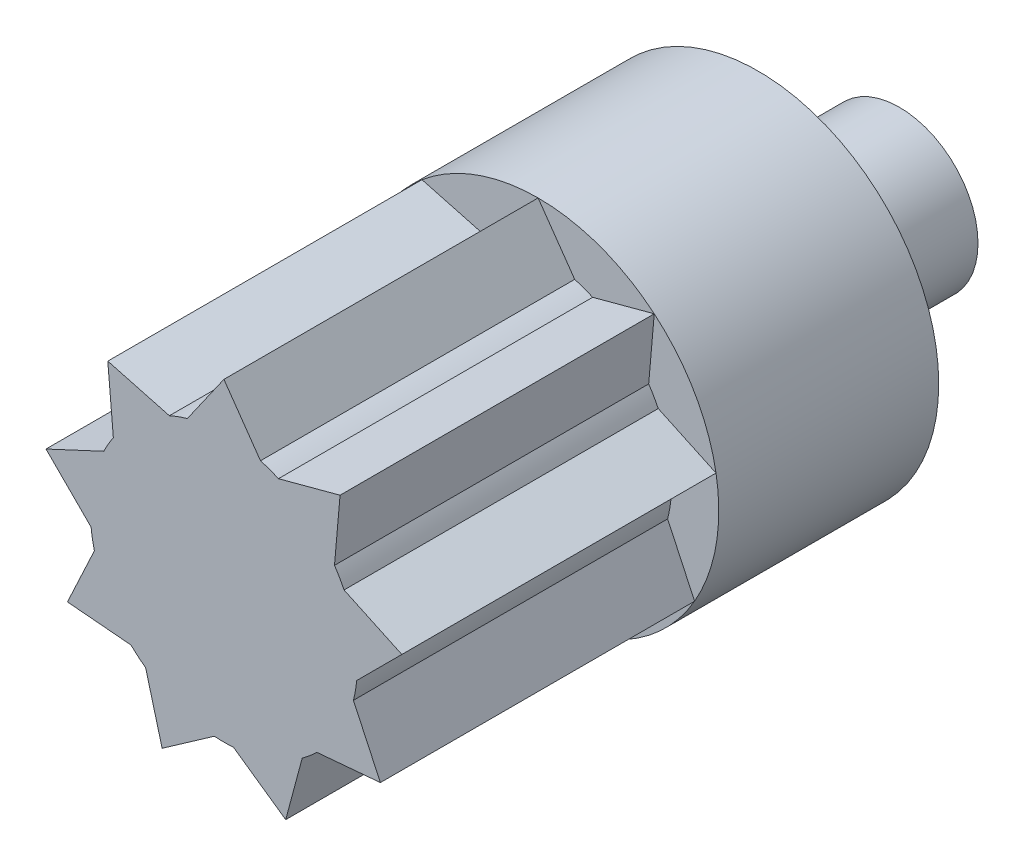
ISO-10303-21;
HEADER;
FILE_DESCRIPTION(('STEP AP214'),'2;1');
FILE_NAME('part.step','',(''),(''),'','','');
FILE_SCHEMA(('AUTOMOTIVE_DESIGN { 1 0 10303 214 1 1 1 1 }'));
ENDSEC;
DATA;
#1=APPLICATION_CONTEXT('core data for automotive mechanical design processes');
#2=APPLICATION_PROTOCOL_DEFINITION('international standard','automotive_design',2000,#1);
#3=PRODUCT_CONTEXT('',#1,'mechanical');
#4=PRODUCT('Part','Part','',(#3));
#5=PRODUCT_RELATED_PRODUCT_CATEGORY('part','',(#4));
#6=PRODUCT_DEFINITION_FORMATION('','',#4);
#7=PRODUCT_DEFINITION_CONTEXT('part definition',#1,'design');
#8=PRODUCT_DEFINITION('design','',#6,#7);
#9=PRODUCT_DEFINITION_SHAPE('','',#8);
#10=(LENGTH_UNIT() NAMED_UNIT(*) SI_UNIT(.MILLI.,.METRE.));
#11=(NAMED_UNIT(*) PLANE_ANGLE_UNIT() SI_UNIT($,.RADIAN.));
#12=(NAMED_UNIT(*) SI_UNIT($,.STERADIAN.) SOLID_ANGLE_UNIT());
#13=UNCERTAINTY_MEASURE_WITH_UNIT(LENGTH_MEASURE(1.E-05),#10,'distance_accuracy_value','');
#14=(GEOMETRIC_REPRESENTATION_CONTEXT(3) GLOBAL_UNCERTAINTY_ASSIGNED_CONTEXT((#13)) GLOBAL_UNIT_ASSIGNED_CONTEXT((#10,
#11,#12)) REPRESENTATION_CONTEXT('',''));
#15=CARTESIAN_POINT('',(0.,0.,0.));
#16=DIRECTION('',(0.,0.,1.));
#17=DIRECTION('',(1.,0.,0.));
#18=AXIS2_PLACEMENT_3D('',#15,#16,#17);
#19=CARTESIAN_POINT('',(-28.51,2.5,-4.));
#20=DIRECTION('',(0.,0.,1.));
#21=DIRECTION('',(1.,0.,0.));
#22=AXIS2_PLACEMENT_3D('',#19,#20,#21);
#23=PLANE('',#22);
#24=CARTESIAN_POINT('',(0.,0.,-4.));
#25=DIRECTION('',(0.,0.,1.));
#26=DIRECTION('',(1.,0.,0.));
#27=AXIS2_PLACEMENT_3D('',#24,#25,#26);
#28=CIRCLE('',#27,2.5);
#29=CARTESIAN_POINT('',(2.5,0.,-4.));
#30=VERTEX_POINT('',#29);
#31=EDGE_CURVE('E488',#30,#30,#28,.T.);
#32=ORIENTED_EDGE('',*,*,#31,.F.);
#33=EDGE_LOOP('',(#32));
#34=FACE_BOUND('',#33,.T.);
#35=ADVANCED_FACE('F41',(#34),#23,.F.);
#36=CARTESIAN_POINT('',(0.,0.,17.5));
#37=DIRECTION('',(0.,0.,-1.));
#38=DIRECTION('',(-1.,0.,0.));
#39=AXIS2_PLACEMENT_3D('',#36,#37,#38);
#40=CYLINDRICAL_SURFACE('',#39,5.75);
#41=CARTESIAN_POINT('',(0.,0.,0.5));
#42=DIRECTION('',(0.,0.,1.));
#43=DIRECTION('',(1.,0.,0.));
#44=AXIS2_PLACEMENT_3D('',#41,#42,#43);
#45=CIRCLE('',#44,5.75);
#46=CARTESIAN_POINT('',(5.75,0.,0.5));
#47=VERTEX_POINT('',#46);
#48=EDGE_CURVE('E486',#47,#47,#45,.T.);
#49=ORIENTED_EDGE('',*,*,#48,.T.);
#50=EDGE_LOOP('',(#49));
#51=FACE_BOUND('',#50,.T.);
#52=CARTESIAN_POINT('',(0.,0.,7.5));
#53=DIRECTION('',(0.,0.,1.));
#54=DIRECTION('',(1.,0.,0.));
#55=AXIS2_PLACEMENT_3D('',#52,#53,#54);
#56=CIRCLE('',#55,5.75);
#57=CARTESIAN_POINT('',(3.6960287556976,4.40475554793412,7.5));
#58=VERTEX_POINT('',#57);
#59=CARTESIAN_POINT('',(0.,5.75,7.5));
#60=VERTEX_POINT('',#59);
#61=EDGE_CURVE('E370',#58,#60,#56,.T.);
#62=ORIENTED_EDGE('',*,*,#61,.F.);
#63=CARTESIAN_POINT('',(0.,0.,7.5));
#64=DIRECTION('',(0.,0.,1.));
#65=DIRECTION('',(1.,0.,0.));
#66=AXIS2_PLACEMENT_3D('',#63,#64,#65);
#67=CIRCLE('',#66,5.75);
#68=CARTESIAN_POINT('',(5.6626445798202,0.99847702158485,7.5));
#69=VERTEX_POINT('',#68);
#70=EDGE_CURVE('E356',#69,#58,#67,.T.);
#71=ORIENTED_EDGE('',*,*,#70,.F.);
#72=CARTESIAN_POINT('',(0.,0.,7.5));
#73=DIRECTION('',(0.,0.,1.));
#74=DIRECTION('',(1.,0.,0.));
#75=AXIS2_PLACEMENT_3D('',#72,#73,#74);
#76=CIRCLE('',#75,5.75);
#77=CARTESIAN_POINT('',(4.97964607176052,-2.875,7.5));
#78=VERTEX_POINT('',#77);
#79=EDGE_CURVE('E426',#78,#69,#76,.T.);
#80=ORIENTED_EDGE('',*,*,#79,.F.);
#81=CARTESIAN_POINT('',(0.,0.,7.5));
#82=DIRECTION('',(0.,0.,1.));
#83=DIRECTION('',(1.,0.,0.));
#84=AXIS2_PLACEMENT_3D('',#81,#82,#83);
#85=CIRCLE('',#84,5.75);
#86=CARTESIAN_POINT('',(1.9666158241226,-5.40323256951897,7.5));
#87=VERTEX_POINT('',#86);
#88=EDGE_CURVE('E334',#87,#78,#85,.T.);
#89=ORIENTED_EDGE('',*,*,#88,.F.);
#90=CARTESIAN_POINT('',(0.,0.,7.5));
#91=DIRECTION('',(0.,0.,1.));
#92=DIRECTION('',(1.,0.,0.));
#93=AXIS2_PLACEMENT_3D('',#90,#91,#92);
#94=CIRCLE('',#93,5.75);
#95=CARTESIAN_POINT('',(-1.9666158241226,-5.40323256951897,7.5));
#96=VERTEX_POINT('',#95);
#97=EDGE_CURVE('E452',#96,#87,#94,.T.);
#98=ORIENTED_EDGE('',*,*,#97,.F.);
#99=CARTESIAN_POINT('',(0.,0.,7.5));
#100=DIRECTION('',(0.,0.,1.));
#101=DIRECTION('',(1.,0.,0.));
#102=AXIS2_PLACEMENT_3D('',#99,#100,#101);
#103=CIRCLE('',#102,5.75);
#104=CARTESIAN_POINT('',(-4.97964607176052,-2.875,7.5));
#105=VERTEX_POINT('',#104);
#106=EDGE_CURVE('E310',#105,#96,#103,.T.);
#107=ORIENTED_EDGE('',*,*,#106,.F.);
#108=CARTESIAN_POINT('',(0.,0.,7.5));
#109=DIRECTION('',(0.,0.,1.));
#110=DIRECTION('',(1.,0.,0.));
#111=AXIS2_PLACEMENT_3D('',#108,#109,#110);
#112=CIRCLE('',#111,5.75);
#113=CARTESIAN_POINT('',(-5.6626445798202,0.998477021584847,7.5));
#114=VERTEX_POINT('',#113);
#115=EDGE_CURVE('E477',#114,#105,#112,.T.);
#116=ORIENTED_EDGE('',*,*,#115,.F.);
#117=CARTESIAN_POINT('',(0.,0.,7.5));
#118=DIRECTION('',(0.,0.,1.));
#119=DIRECTION('',(1.,0.,0.));
#120=AXIS2_PLACEMENT_3D('',#117,#118,#119);
#121=CIRCLE('',#120,5.75);
#122=CARTESIAN_POINT('',(-3.6960287556976,4.40475554793412,7.5));
#123=VERTEX_POINT('',#122);
#124=EDGE_CURVE('E286',#123,#114,#121,.T.);
#125=ORIENTED_EDGE('',*,*,#124,.F.);
#126=CARTESIAN_POINT('',(0.,0.,7.5));
#127=DIRECTION('',(0.,0.,1.));
#128=DIRECTION('',(1.,0.,0.));
#129=AXIS2_PLACEMENT_3D('',#126,#127,#128);
#130=CIRCLE('',#129,5.75);
#131=EDGE_CURVE('E260',#60,#123,#130,.T.);
#132=ORIENTED_EDGE('',*,*,#131,.F.);
#133=EDGE_LOOP('',(#62,#71,#80,#89,#98,#107,#116,#125,#132));
#134=FACE_BOUND('',#133,.T.);
#135=ADVANCED_FACE('F381',(#51,#134),#40,.T.);
#136=CARTESIAN_POINT('',(0.,0.,0.5));
#137=DIRECTION('',(0.,0.,-1.));
#138=DIRECTION('',(-1.,0.,0.));
#139=AXIS2_PLACEMENT_3D('',#136,#137,#138);
#140=CYLINDRICAL_SURFACE('',#139,2.5);
#141=CARTESIAN_POINT('',(0.,0.,0.5));
#142=DIRECTION('',(0.,0.,1.));
#143=DIRECTION('',(1.,0.,0.));
#144=AXIS2_PLACEMENT_3D('',#141,#142,#143);
#145=CIRCLE('',#144,2.5);
#146=CARTESIAN_POINT('',(2.5,0.,0.5));
#147=VERTEX_POINT('',#146);
#148=EDGE_CURVE('E492',#147,#147,#145,.T.);
#149=ORIENTED_EDGE('',*,*,#148,.F.);
#150=EDGE_LOOP('',(#149));
#151=FACE_BOUND('',#150,.T.);
#152=ORIENTED_EDGE('',*,*,#31,.T.);
#153=EDGE_LOOP('',(#152));
#154=FACE_BOUND('',#153,.T.);
#155=ADVANCED_FACE('F501',(#151,#154),#140,.T.);
#156=CARTESIAN_POINT('',(0.,0.,17.5));
#157=DIRECTION('',(0.,0.,1.));
#158=DIRECTION('',(1.,0.,0.));
#159=AXIS2_PLACEMENT_3D('',#156,#157,#158);
#160=PLANE('',#159);
#161=DIRECTION('',(0.573576436351047,-0.819152044288991,0.));
#162=VECTOR('',#161,1.);
#163=CARTESIAN_POINT('',(2.70161628475949,1.89169208793871,17.5));
#164=LINE('',#163,#162);
#165=CARTESIAN_POINT('',(0.,5.75,17.5));
#166=VERTEX_POINT('',#165);
#167=CARTESIAN_POINT('',(1.16412429290387,4.08745821148927,17.5));
#168=VERTEX_POINT('',#167);
#169=EDGE_CURVE('E251',#166,#168,#164,.T.);
#170=ORIENTED_EDGE('',*,*,#169,.F.);
#171=DIRECTION('',(-0.573576436351047,-0.819152044288991,0.));
#172=VECTOR('',#171,1.);
#173=CARTESIAN_POINT('',(-2.70161628475949,1.89169208793871,17.5));
#174=LINE('',#173,#172);
#175=CARTESIAN_POINT('',(-1.16412429290387,4.08745821148927,17.5));
#176=VERTEX_POINT('',#175);
#177=EDGE_CURVE('E238',#166,#176,#174,.T.);
#178=ORIENTED_EDGE('',*,*,#177,.T.);
#179=CARTESIAN_POINT('',(0.,0.,17.5));
#180=DIRECTION('',(0.,0.,1.));
#181=DIRECTION('',(1.,0.,0.));
#182=AXIS2_PLACEMENT_3D('',#179,#180,#181);
#183=CIRCLE('',#182,4.25);
#184=CARTESIAN_POINT('',(-1.73559654777799,3.8794593210061,17.5));
#185=VERTEX_POINT('',#184);
#186=EDGE_CURVE('E226',#176,#185,#183,.T.);
#187=ORIENTED_EDGE('',*,*,#186,.T.);
#188=DIRECTION('',(0.965925826289069,-0.258819045102519,0.));
#189=VECTOR('',#188,1.);
#190=CARTESIAN_POINT('',(0.853601906910682,3.18568568602837,17.5));
#191=LINE('',#190,#189);
#192=CARTESIAN_POINT('',(-3.6960287556976,4.40475554793412,17.5));
#193=VERTEX_POINT('',#192);
#194=EDGE_CURVE('E252',#193,#185,#191,.T.);
#195=ORIENTED_EDGE('',*,*,#194,.F.);
#196=DIRECTION('',(0.0871557427476576,-0.996194698091746,0.));
#197=VECTOR('',#196,1.);
#198=CARTESIAN_POINT('',(-3.28551437784881,-0.287445261913198,17.5));
#199=LINE('',#198,#197);
#200=CARTESIAN_POINT('',(-3.51913843913562,2.38288997777868,17.5));
#201=VERTEX_POINT('',#200);
#202=EDGE_CURVE('E276',#193,#201,#199,.T.);
#203=ORIENTED_EDGE('',*,*,#202,.T.);
#204=CARTESIAN_POINT('',(0.,0.,17.5));
#205=DIRECTION('',(0.,0.,1.));
#206=DIRECTION('',(1.,0.,0.));
#207=AXIS2_PLACEMENT_3D('',#204,#205,#206);
#208=CIRCLE('',#207,4.25);
#209=CARTESIAN_POINT('',(-3.82321247474749,1.85621829883642,17.5));
#210=VERTEX_POINT('',#209);
#211=EDGE_CURVE('E280',#201,#210,#208,.T.);
#212=ORIENTED_EDGE('',*,*,#211,.T.);
#213=DIRECTION('',(0.906307787036649,0.422618261740701,0.));
#214=VECTOR('',#213,1.);
#215=CARTESIAN_POINT('',(-1.3938222899101,2.98906154667269,17.5));
#216=LINE('',#215,#214);
#217=CARTESIAN_POINT('',(-5.6626445798202,0.998477021584847,17.5));
#218=VERTEX_POINT('',#217);
#219=EDGE_CURVE('E273',#218,#210,#216,.T.);
#220=ORIENTED_EDGE('',*,*,#219,.F.);
#221=DIRECTION('',(0.707106781186547,-0.707106781186548,0.));
#222=VECTOR('',#221,1.);
#223=CARTESIAN_POINT('',(-2.33208377911768,-2.33208377911767,17.5));
#224=LINE('',#223,#222);
#225=CARTESIAN_POINT('',(-4.22750859882861,-0.436658959406742,17.5));
#226=VERTEX_POINT('',#225);
#227=EDGE_CURVE('E469',#218,#226,#224,.T.);
#228=ORIENTED_EDGE('',*,*,#227,.T.);
#229=CARTESIAN_POINT('',(0.,0.,17.5));
#230=DIRECTION('',(0.,0.,1.));
#231=DIRECTION('',(1.,0.,0.));
#232=AXIS2_PLACEMENT_3D('',#229,#230,#231);
#233=CIRCLE('',#232,4.25);
#234=CARTESIAN_POINT('',(-4.12190479450895,-1.03556789492729,17.5));
#235=VERTEX_POINT('',#234);
#236=EDGE_CURVE('E440',#226,#235,#233,.T.);
#237=ORIENTED_EDGE('',*,*,#236,.T.);
#238=DIRECTION('',(0.422618261740698,0.906307787036651,0.));
#239=VECTOR('',#238,1.);
#240=CARTESIAN_POINT('',(-2.98906154667269,1.3938222899101,17.5));
#241=LINE('',#240,#239);
#242=CARTESIAN_POINT('',(-4.97964607176052,-2.875,17.5));
#243=VERTEX_POINT('',#242);
#244=EDGE_CURVE('E466',#243,#235,#241,.T.);
#245=ORIENTED_EDGE('',*,*,#244,.F.);
#246=DIRECTION('',(0.996194698091746,-0.0871557427476587,0.));
#247=VECTOR('',#246,1.);
#248=CARTESIAN_POINT('',(-0.287445261913201,-3.28551437784881,17.5));
#249=LINE('',#248,#247);
#250=CARTESIAN_POINT('',(-2.95778050160508,-3.05189031656198,17.5));
#251=VERTEX_POINT('',#250);
#252=EDGE_CURVE('E300',#243,#251,#249,.T.);
#253=ORIENTED_EDGE('',*,*,#252,.T.);
#254=CARTESIAN_POINT('',(0.,0.,17.5));
#255=DIRECTION('',(0.,0.,1.));
#256=DIRECTION('',(1.,0.,0.));
#257=AXIS2_PLACEMENT_3D('',#254,#255,#256);
#258=CIRCLE('',#257,4.25);
#259=CARTESIAN_POINT('',(-2.49191205105062,-3.44280036159936,17.5));
#260=VERTEX_POINT('',#259);
#261=EDGE_CURVE('E304',#251,#260,#258,.T.);
#262=ORIENTED_EDGE('',*,*,#261,.T.);
#263=DIRECTION('',(-0.258819045102522,0.965925826289068,0.));
#264=VECTOR('',#263,1.);
#265=CARTESIAN_POINT('',(-3.18568568602836,-0.853601906910691,17.5));
#266=LINE('',#265,#264);
#267=CARTESIAN_POINT('',(-1.9666158241226,-5.40323256951897,17.5));
#268=VERTEX_POINT('',#267);
#269=EDGE_CURVE('E297',#268,#260,#266,.T.);
#270=ORIENTED_EDGE('',*,*,#269,.F.);
#271=DIRECTION('',(0.819152044288993,0.573576436351045,0.));
#272=VECTOR('',#271,1.);
#273=CARTESIAN_POINT('',(1.8916920879387,-2.70161628475949,17.5));
#274=LINE('',#273,#272);
#275=CARTESIAN_POINT('',(-0.304074035611864,-4.23910827661511,17.5));
#276=VERTEX_POINT('',#275);
#277=EDGE_CURVE('E444',#268,#276,#274,.T.);
#278=ORIENTED_EDGE('',*,*,#277,.T.);
#279=CARTESIAN_POINT('',(0.,0.,17.5));
#280=DIRECTION('',(0.,0.,1.));
#281=DIRECTION('',(1.,0.,0.));
#282=AXIS2_PLACEMENT_3D('',#279,#280,#281);
#283=CIRCLE('',#282,4.25);
#284=CARTESIAN_POINT('',(0.304074035611864,-4.23910827661511,17.5));
#285=VERTEX_POINT('',#284);
#286=EDGE_CURVE('E412',#276,#285,#283,.T.);
#287=ORIENTED_EDGE('',*,*,#286,.T.);
#288=DIRECTION('',(-0.819152044288993,0.573576436351045,0.));
#289=VECTOR('',#288,1.);
#290=CARTESIAN_POINT('',(-1.8916920879387,-2.70161628475949,17.5));
#291=LINE('',#290,#289);
#292=CARTESIAN_POINT('',(1.9666158241226,-5.40323256951897,17.5));
#293=VERTEX_POINT('',#292);
#294=EDGE_CURVE('E441',#293,#285,#291,.T.);
#295=ORIENTED_EDGE('',*,*,#294,.F.);
#296=DIRECTION('',(0.258819045102522,0.965925826289068,0.));
#297=VECTOR('',#296,1.);
#298=CARTESIAN_POINT('',(3.18568568602836,-0.853601906910691,17.5));
#299=LINE('',#298,#297);
#300=CARTESIAN_POINT('',(2.49191205105062,-3.44280036159936,17.5));
#301=VERTEX_POINT('',#300);
#302=EDGE_CURVE('E324',#293,#301,#299,.T.);
#303=ORIENTED_EDGE('',*,*,#302,.T.);
#304=CARTESIAN_POINT('',(0.,0.,17.5));
#305=DIRECTION('',(0.,0.,1.));
#306=DIRECTION('',(1.,0.,0.));
#307=AXIS2_PLACEMENT_3D('',#304,#305,#306);
#308=CIRCLE('',#307,4.25);
#309=CARTESIAN_POINT('',(2.95778050160508,-3.05189031656198,17.5));
#310=VERTEX_POINT('',#309);
#311=EDGE_CURVE('E328',#301,#310,#308,.T.);
#312=ORIENTED_EDGE('',*,*,#311,.T.);
#313=DIRECTION('',(-0.996194698091745,-0.0871557427476596,0.));
#314=VECTOR('',#313,1.);
#315=CARTESIAN_POINT('',(0.287445261913204,-3.28551437784881,17.5));
#316=LINE('',#315,#314);
#317=CARTESIAN_POINT('',(4.97964607176052,-2.875,17.5));
#318=VERTEX_POINT('',#317);
#319=EDGE_CURVE('E321',#318,#310,#316,.T.);
#320=ORIENTED_EDGE('',*,*,#319,.F.);
#321=DIRECTION('',(-0.422618261740698,0.90630778703665,0.));
#322=VECTOR('',#321,1.);
#323=CARTESIAN_POINT('',(2.98906154667269,1.3938222899101,17.5));
#324=LINE('',#323,#322);
#325=CARTESIAN_POINT('',(4.12190479450895,-1.03556789492729,17.5));
#326=VERTEX_POINT('',#325);
#327=EDGE_CURVE('E418',#318,#326,#324,.T.);
#328=ORIENTED_EDGE('',*,*,#327,.T.);
#329=CARTESIAN_POINT('',(0.,0.,17.5));
#330=DIRECTION('',(0.,0.,1.));
#331=DIRECTION('',(1.,0.,0.));
#332=AXIS2_PLACEMENT_3D('',#329,#330,#331);
#333=CIRCLE('',#332,4.25);
#334=CARTESIAN_POINT('',(4.22750859882861,-0.436658959406741,17.5));
#335=VERTEX_POINT('',#334);
#336=EDGE_CURVE('E272',#326,#335,#333,.T.);
#337=ORIENTED_EDGE('',*,*,#336,.T.);
#338=DIRECTION('',(-0.707106781186547,-0.707106781186548,0.));
#339=VECTOR('',#338,1.);
#340=CARTESIAN_POINT('',(2.33208377911768,-2.33208377911767,17.5));
#341=LINE('',#340,#339);
#342=CARTESIAN_POINT('',(5.6626445798202,0.99847702158485,17.5));
#343=VERTEX_POINT('',#342);
#344=EDGE_CURVE('E416',#343,#335,#341,.T.);
#345=ORIENTED_EDGE('',*,*,#344,.F.);
#346=DIRECTION('',(-0.90630778703665,0.4226182617407,0.));
#347=VECTOR('',#346,1.);
#348=CARTESIAN_POINT('',(1.3938222899101,2.98906154667269,17.5));
#349=LINE('',#348,#347);
#350=CARTESIAN_POINT('',(3.82321247474749,1.85621829883643,17.5));
#351=VERTEX_POINT('',#350);
#352=EDGE_CURVE('E347',#343,#351,#349,.T.);
#353=ORIENTED_EDGE('',*,*,#352,.T.);
#354=CARTESIAN_POINT('',(0.,0.,17.5));
#355=DIRECTION('',(0.,0.,1.));
#356=DIRECTION('',(1.,0.,0.));
#357=AXIS2_PLACEMENT_3D('',#354,#355,#356);
#358=CIRCLE('',#357,4.25);
#359=CARTESIAN_POINT('',(3.51913843913562,2.38288997777868,17.5));
#360=VERTEX_POINT('',#359);
#361=EDGE_CURVE('E351',#351,#360,#358,.T.);
#362=ORIENTED_EDGE('',*,*,#361,.T.);
#363=DIRECTION('',(-0.0871557427476572,-0.996194698091746,0.));
#364=VECTOR('',#363,1.);
#365=CARTESIAN_POINT('',(3.28551437784881,-0.287445261913196,17.5));
#366=LINE('',#365,#364);
#367=CARTESIAN_POINT('',(3.6960287556976,4.40475554793412,17.5));
#368=VERTEX_POINT('',#367);
#369=EDGE_CURVE('E344',#368,#360,#366,.T.);
#370=ORIENTED_EDGE('',*,*,#369,.F.);
#371=DIRECTION('',(-0.965925826289069,-0.25881904510252,0.));
#372=VECTOR('',#371,1.);
#373=CARTESIAN_POINT('',(-0.853601906910684,3.18568568602837,17.5));
#374=LINE('',#373,#372);
#375=CARTESIAN_POINT('',(1.73559654777799,3.8794593210061,17.5));
#376=VERTEX_POINT('',#375);
#377=EDGE_CURVE('E51',#368,#376,#374,.T.);
#378=ORIENTED_EDGE('',*,*,#377,.T.);
#379=CARTESIAN_POINT('',(0.,0.,17.5));
#380=DIRECTION('',(0.,0.,1.));
#381=DIRECTION('',(1.,0.,0.));
#382=AXIS2_PLACEMENT_3D('',#379,#380,#381);
#383=CIRCLE('',#382,4.25);
#384=EDGE_CURVE('E11',#376,#168,#383,.T.);
#385=ORIENTED_EDGE('',*,*,#384,.T.);
#386=EDGE_LOOP('',(#170,#178,#187,#195,#203,#212,#220,#228,#237,#245,#253,#262,#270,#278,#287,
#295,#303,#312,#320,#328,#337,#345,#353,#362,#370,#378,#385));
#387=FACE_BOUND('',#386,.T.);
#388=ADVANCED_FACE('F250',(#387),#160,.T.);
#389=CARTESIAN_POINT('',(0.,0.,0.5));
#390=DIRECTION('',(0.,0.,1.));
#391=DIRECTION('',(1.,0.,0.));
#392=AXIS2_PLACEMENT_3D('',#389,#390,#391);
#393=PLANE('',#392);
#394=ORIENTED_EDGE('',*,*,#148,.T.);
#395=EDGE_LOOP('',(#394));
#396=FACE_BOUND('',#395,.T.);
#397=ORIENTED_EDGE('',*,*,#48,.F.);
#398=EDGE_LOOP('',(#397));
#399=FACE_BOUND('',#398,.T.);
#400=ADVANCED_FACE('F498',(#396,#399),#393,.F.);
#401=CARTESIAN_POINT('',(0.,0.,7.5));
#402=DIRECTION('',(0.,0.,1.));
#403=DIRECTION('',(1.,0.,0.));
#404=AXIS2_PLACEMENT_3D('',#401,#402,#403);
#405=CYLINDRICAL_SURFACE('',#404,4.25);
#406=ORIENTED_EDGE('',*,*,#336,.F.);
#407=DIRECTION('',(0.,0.,1.));
#408=VECTOR('',#407,1.);
#409=CARTESIAN_POINT('',(4.12190479450895,-1.03556789492729,7.5));
#410=LINE('',#409,#408);
#411=CARTESIAN_POINT('',(4.12190479450895,-1.03556789492729,7.5));
#412=VERTEX_POINT('',#411);
#413=EDGE_CURVE('E406',#412,#326,#410,.T.);
#414=ORIENTED_EDGE('',*,*,#413,.F.);
#415=CARTESIAN_POINT('',(0.,0.,7.5));
#416=DIRECTION('',(0.,0.,1.));
#417=DIRECTION('',(1.,0.,0.));
#418=AXIS2_PLACEMENT_3D('',#415,#416,#417);
#419=CIRCLE('',#418,4.25);
#420=CARTESIAN_POINT('',(4.22750859882861,-0.436658959406741,7.5));
#421=VERTEX_POINT('',#420);
#422=EDGE_CURVE('E419',#412,#421,#419,.T.);
#423=ORIENTED_EDGE('',*,*,#422,.T.);
#424=DIRECTION('',(0.,0.,1.));
#425=VECTOR('',#424,1.);
#426=CARTESIAN_POINT('',(4.22750859882861,-0.436658959406741,7.5));
#427=LINE('',#426,#425);
#428=EDGE_CURVE('E407',#421,#335,#427,.T.);
#429=ORIENTED_EDGE('',*,*,#428,.T.);
#430=EDGE_LOOP('',(#406,#414,#423,#429));
#431=FACE_BOUND('',#430,.T.);
#432=ADVANCED_FACE('F636',(#431),#405,.T.);
#433=CARTESIAN_POINT('',(2.33208377911768,-2.33208377911767,7.5));
#434=DIRECTION('',(-0.707106781186548,0.707106781186547,0.));
#435=DIRECTION('',(-0.707106781186547,-0.707106781186548,0.));
#436=AXIS2_PLACEMENT_3D('',#433,#434,#435);
#437=PLANE('',#436);
#438=ORIENTED_EDGE('',*,*,#344,.T.);
#439=ORIENTED_EDGE('',*,*,#428,.F.);
#440=DIRECTION('',(-0.707106781186547,-0.707106781186548,0.));
#441=VECTOR('',#440,1.);
#442=CARTESIAN_POINT('',(2.33208377911768,-2.33208377911767,7.5));
#443=LINE('',#442,#441);
#444=EDGE_CURVE('E410',#69,#421,#443,.T.);
#445=ORIENTED_EDGE('',*,*,#444,.F.);
#446=DIRECTION('',(0.,0.,1.));
#447=VECTOR('',#446,1.);
#448=CARTESIAN_POINT('',(5.6626445798202,0.99847702158485,7.5));
#449=LINE('',#448,#447);
#450=EDGE_CURVE('E401',#69,#343,#449,.T.);
#451=ORIENTED_EDGE('',*,*,#450,.T.);
#452=EDGE_LOOP('',(#438,#439,#445,#451));
#453=FACE_BOUND('',#452,.T.);
#454=ADVANCED_FACE('F633',(#453),#437,.F.);
#455=CARTESIAN_POINT('',(2.98906154667269,1.3938222899101,7.5));
#456=DIRECTION('',(0.90630778703665,0.422618261740698,0.));
#457=DIRECTION('',(-0.422618261740698,0.90630778703665,0.));
#458=AXIS2_PLACEMENT_3D('',#455,#456,#457);
#459=PLANE('',#458);
#460=ORIENTED_EDGE('',*,*,#327,.F.);
#461=DIRECTION('',(0.,0.,1.));
#462=VECTOR('',#461,1.);
#463=CARTESIAN_POINT('',(4.97964607176052,-2.875,7.5));
#464=LINE('',#463,#462);
#465=EDGE_CURVE('E318',#78,#318,#464,.T.);
#466=ORIENTED_EDGE('',*,*,#465,.F.);
#467=DIRECTION('',(-0.422618261740698,0.90630778703665,0.));
#468=VECTOR('',#467,1.);
#469=CARTESIAN_POINT('',(2.98906154667269,1.3938222899101,7.5));
#470=LINE('',#469,#468);
#471=EDGE_CURVE('E428',#78,#412,#470,.T.);
#472=ORIENTED_EDGE('',*,*,#471,.T.);
#473=ORIENTED_EDGE('',*,*,#413,.T.);
#474=EDGE_LOOP('',(#460,#466,#472,#473));
#475=FACE_BOUND('',#474,.T.);
#476=ADVANCED_FACE('F631',(#475),#459,.T.);
#477=CARTESIAN_POINT('',(0.,0.,7.5));
#478=DIRECTION('',(0.,0.,1.));
#479=DIRECTION('',(1.,0.,0.));
#480=AXIS2_PLACEMENT_3D('',#477,#478,#479);
#481=PLANE('',#480);
#482=ORIENTED_EDGE('',*,*,#422,.F.);
#483=ORIENTED_EDGE('',*,*,#471,.F.);
#484=ORIENTED_EDGE('',*,*,#79,.T.);
#485=ORIENTED_EDGE('',*,*,#444,.T.);
#486=EDGE_LOOP('',(#482,#483,#484,#485));
#487=FACE_BOUND('',#486,.T.);
#488=ADVANCED_FACE('F627',(#487),#481,.T.);
#489=CARTESIAN_POINT('',(0.,0.,7.5));
#490=DIRECTION('',(0.,0.,1.));
#491=DIRECTION('',(1.,0.,0.));
#492=AXIS2_PLACEMENT_3D('',#489,#490,#491);
#493=CYLINDRICAL_SURFACE('',#492,4.25);
#494=ORIENTED_EDGE('',*,*,#286,.F.);
#495=DIRECTION('',(0.,0.,1.));
#496=VECTOR('',#495,1.);
#497=CARTESIAN_POINT('',(-0.304074035611864,-4.23910827661511,7.5));
#498=LINE('',#497,#496);
#499=CARTESIAN_POINT('',(-0.304074035611864,-4.23910827661511,7.5));
#500=VERTEX_POINT('',#499);
#501=EDGE_CURVE('E431',#500,#276,#498,.T.);
#502=ORIENTED_EDGE('',*,*,#501,.F.);
#503=CARTESIAN_POINT('',(0.,0.,7.5));
#504=DIRECTION('',(0.,0.,1.));
#505=DIRECTION('',(1.,0.,0.));
#506=AXIS2_PLACEMENT_3D('',#503,#504,#505);
#507=CIRCLE('',#506,4.25);
#508=CARTESIAN_POINT('',(0.304074035611864,-4.23910827661511,7.5));
#509=VERTEX_POINT('',#508);
#510=EDGE_CURVE('E445',#500,#509,#507,.T.);
#511=ORIENTED_EDGE('',*,*,#510,.T.);
#512=DIRECTION('',(0.,0.,1.));
#513=VECTOR('',#512,1.);
#514=CARTESIAN_POINT('',(0.304074035611864,-4.23910827661511,7.5));
#515=LINE('',#514,#513);
#516=EDGE_CURVE('E438',#509,#285,#515,.T.);
#517=ORIENTED_EDGE('',*,*,#516,.T.);
#518=EDGE_LOOP('',(#494,#502,#511,#517));
#519=FACE_BOUND('',#518,.T.);
#520=ADVANCED_FACE('F620',(#519),#493,.T.);
#521=CARTESIAN_POINT('',(-1.8916920879387,-2.70161628475949,7.5));
#522=DIRECTION('',(0.573576436351045,0.819152044288993,0.));
#523=DIRECTION('',(-0.819152044288993,0.573576436351045,0.));
#524=AXIS2_PLACEMENT_3D('',#521,#522,#523);
#525=PLANE('',#524);
#526=ORIENTED_EDGE('',*,*,#294,.T.);
#527=ORIENTED_EDGE('',*,*,#516,.F.);
#528=DIRECTION('',(-0.819152044288993,0.573576436351045,0.));
#529=VECTOR('',#528,1.);
#530=CARTESIAN_POINT('',(-1.8916920879387,-2.70161628475949,7.5));
#531=LINE('',#530,#529);
#532=EDGE_CURVE('E434',#87,#509,#531,.T.);
#533=ORIENTED_EDGE('',*,*,#532,.F.);
#534=DIRECTION('',(0.,0.,1.));
#535=VECTOR('',#534,1.);
#536=CARTESIAN_POINT('',(1.9666158241226,-5.40323256951897,7.5));
#537=LINE('',#536,#535);
#538=EDGE_CURVE('E435',#87,#293,#537,.T.);
#539=ORIENTED_EDGE('',*,*,#538,.T.);
#540=EDGE_LOOP('',(#526,#527,#533,#539));
#541=FACE_BOUND('',#540,.T.);
#542=ADVANCED_FACE('F617',(#541),#525,.F.);
#543=CARTESIAN_POINT('',(1.8916920879387,-2.70161628475949,7.5));
#544=DIRECTION('',(0.573576436351045,-0.819152044288992,0.));
#545=DIRECTION('',(0.819152044288992,0.573576436351045,0.));
#546=AXIS2_PLACEMENT_3D('',#543,#544,#545);
#547=PLANE('',#546);
#548=ORIENTED_EDGE('',*,*,#277,.F.);
#549=DIRECTION('',(0.,0.,1.));
#550=VECTOR('',#549,1.);
#551=CARTESIAN_POINT('',(-1.9666158241226,-5.40323256951897,7.5));
#552=LINE('',#551,#550);
#553=EDGE_CURVE('E294',#96,#268,#552,.T.);
#554=ORIENTED_EDGE('',*,*,#553,.F.);
#555=DIRECTION('',(0.819152044288993,0.573576436351045,0.));
#556=VECTOR('',#555,1.);
#557=CARTESIAN_POINT('',(1.8916920879387,-2.70161628475949,7.5));
#558=LINE('',#557,#556);
#559=EDGE_CURVE('E455',#96,#500,#558,.T.);
#560=ORIENTED_EDGE('',*,*,#559,.T.);
#561=ORIENTED_EDGE('',*,*,#501,.T.);
#562=EDGE_LOOP('',(#548,#554,#560,#561));
#563=FACE_BOUND('',#562,.T.);
#564=ADVANCED_FACE('F615',(#563),#547,.T.);
#565=CARTESIAN_POINT('',(0.,0.,7.5));
#566=DIRECTION('',(0.,0.,1.));
#567=DIRECTION('',(1.,0.,0.));
#568=AXIS2_PLACEMENT_3D('',#565,#566,#567);
#569=PLANE('',#568);
#570=ORIENTED_EDGE('',*,*,#510,.F.);
#571=ORIENTED_EDGE('',*,*,#559,.F.);
#572=ORIENTED_EDGE('',*,*,#97,.T.);
#573=ORIENTED_EDGE('',*,*,#532,.T.);
#574=EDGE_LOOP('',(#570,#571,#572,#573));
#575=FACE_BOUND('',#574,.T.);
#576=ADVANCED_FACE('F611',(#575),#569,.T.);
#577=CARTESIAN_POINT('',(0.,0.,7.5));
#578=DIRECTION('',(0.,0.,1.));
#579=DIRECTION('',(1.,0.,0.));
#580=AXIS2_PLACEMENT_3D('',#577,#578,#579);
#581=CYLINDRICAL_SURFACE('',#580,4.25);
#582=ORIENTED_EDGE('',*,*,#236,.F.);
#583=DIRECTION('',(0.,0.,1.));
#584=VECTOR('',#583,1.);
#585=CARTESIAN_POINT('',(-4.22750859882861,-0.436658959406742,7.5));
#586=LINE('',#585,#584);
#587=CARTESIAN_POINT('',(-4.22750859882861,-0.436658959406742,7.5));
#588=VERTEX_POINT('',#587);
#589=EDGE_CURVE('E458',#588,#226,#586,.T.);
#590=ORIENTED_EDGE('',*,*,#589,.F.);
#591=CARTESIAN_POINT('',(0.,0.,7.5));
#592=DIRECTION('',(0.,0.,1.));
#593=DIRECTION('',(1.,0.,0.));
#594=AXIS2_PLACEMENT_3D('',#591,#592,#593);
#595=CIRCLE('',#594,4.25);
#596=CARTESIAN_POINT('',(-4.12190479450895,-1.03556789492729,7.5));
#597=VERTEX_POINT('',#596);
#598=EDGE_CURVE('E470',#588,#597,#595,.T.);
#599=ORIENTED_EDGE('',*,*,#598,.T.);
#600=DIRECTION('',(0.,0.,1.));
#601=VECTOR('',#600,1.);
#602=CARTESIAN_POINT('',(-4.12190479450895,-1.03556789492729,7.5));
#603=LINE('',#602,#601);
#604=EDGE_CURVE('E237',#597,#235,#603,.T.);
#605=ORIENTED_EDGE('',*,*,#604,.T.);
#606=EDGE_LOOP('',(#582,#590,#599,#605));
#607=FACE_BOUND('',#606,.T.);
#608=ADVANCED_FACE('F604',(#607),#581,.T.);
#609=CARTESIAN_POINT('',(-2.98906154667269,1.3938222899101,7.5));
#610=DIRECTION('',(0.906307787036651,-0.422618261740698,0.));
#611=DIRECTION('',(0.422618261740698,0.906307787036651,0.));
#612=AXIS2_PLACEMENT_3D('',#609,#610,#611);
#613=PLANE('',#612);
#614=ORIENTED_EDGE('',*,*,#244,.T.);
#615=ORIENTED_EDGE('',*,*,#604,.F.);
#616=DIRECTION('',(0.422618261740698,0.906307787036651,0.));
#617=VECTOR('',#616,1.);
#618=CARTESIAN_POINT('',(-2.98906154667269,1.3938222899101,7.5));
#619=LINE('',#618,#617);
#620=EDGE_CURVE('E461',#105,#597,#619,.T.);
#621=ORIENTED_EDGE('',*,*,#620,.F.);
#622=DIRECTION('',(0.,0.,1.));
#623=VECTOR('',#622,1.);
#624=CARTESIAN_POINT('',(-4.97964607176052,-2.875,7.5));
#625=LINE('',#624,#623);
#626=EDGE_CURVE('E462',#105,#243,#625,.T.);
#627=ORIENTED_EDGE('',*,*,#626,.T.);
#628=EDGE_LOOP('',(#614,#615,#621,#627));
#629=FACE_BOUND('',#628,.T.);
#630=ADVANCED_FACE('F601',(#629),#613,.F.);
#631=CARTESIAN_POINT('',(-2.33208377911768,-2.33208377911767,7.5));
#632=DIRECTION('',(-0.707106781186548,-0.707106781186547,0.));
#633=DIRECTION('',(0.707106781186547,-0.707106781186548,0.));
#634=AXIS2_PLACEMENT_3D('',#631,#632,#633);
#635=PLANE('',#634);
#636=ORIENTED_EDGE('',*,*,#227,.F.);
#637=DIRECTION('',(0.,0.,1.));
#638=VECTOR('',#637,1.);
#639=CARTESIAN_POINT('',(-5.6626445798202,0.998477021584847,7.5));
#640=LINE('',#639,#638);
#641=EDGE_CURVE('E268',#114,#218,#640,.T.);
#642=ORIENTED_EDGE('',*,*,#641,.F.);
#643=DIRECTION('',(0.707106781186547,-0.707106781186548,0.));
#644=VECTOR('',#643,1.);
#645=CARTESIAN_POINT('',(-2.33208377911768,-2.33208377911767,7.5));
#646=LINE('',#645,#644);
#647=EDGE_CURVE('E480',#114,#588,#646,.T.);
#648=ORIENTED_EDGE('',*,*,#647,.T.);
#649=ORIENTED_EDGE('',*,*,#589,.T.);
#650=EDGE_LOOP('',(#636,#642,#648,#649));
#651=FACE_BOUND('',#650,.T.);
#652=ADVANCED_FACE('F599',(#651),#635,.T.);
#653=CARTESIAN_POINT('',(0.,0.,7.5));
#654=DIRECTION('',(0.,0.,1.));
#655=DIRECTION('',(1.,0.,0.));
#656=AXIS2_PLACEMENT_3D('',#653,#654,#655);
#657=PLANE('',#656);
#658=ORIENTED_EDGE('',*,*,#598,.F.);
#659=ORIENTED_EDGE('',*,*,#647,.F.);
#660=ORIENTED_EDGE('',*,*,#115,.T.);
#661=ORIENTED_EDGE('',*,*,#620,.T.);
#662=EDGE_LOOP('',(#658,#659,#660,#661));
#663=FACE_BOUND('',#662,.T.);
#664=ADVANCED_FACE('F596',(#663),#657,.T.);
#665=CARTESIAN_POINT('',(0.,0.,7.5));
#666=DIRECTION('',(0.,0.,1.));
#667=DIRECTION('',(1.,0.,0.));
#668=AXIS2_PLACEMENT_3D('',#665,#666,#667);
#669=CYLINDRICAL_SURFACE('',#668,4.25);
#670=ORIENTED_EDGE('',*,*,#186,.F.);
#671=DIRECTION('',(0.,0.,1.));
#672=VECTOR('',#671,1.);
#673=CARTESIAN_POINT('',(-1.16412429290387,4.08745821148927,7.5));
#674=LINE('',#673,#672);
#675=CARTESIAN_POINT('',(-1.16412429290387,4.08745821148927,7.5));
#676=VERTEX_POINT('',#675);
#677=EDGE_CURVE('E229',#676,#176,#674,.T.);
#678=ORIENTED_EDGE('',*,*,#677,.F.);
#679=CARTESIAN_POINT('',(0.,0.,7.5));
#680=DIRECTION('',(0.,0.,1.));
#681=DIRECTION('',(1.,0.,0.));
#682=AXIS2_PLACEMENT_3D('',#679,#680,#681);
#683=CIRCLE('',#682,4.25);
#684=CARTESIAN_POINT('',(-1.73559654777799,3.8794593210061,7.5));
#685=VERTEX_POINT('',#684);
#686=EDGE_CURVE('E254',#676,#685,#683,.T.);
#687=ORIENTED_EDGE('',*,*,#686,.T.);
#688=DIRECTION('',(0.,0.,1.));
#689=VECTOR('',#688,1.);
#690=CARTESIAN_POINT('',(-1.73559654777799,3.8794593210061,7.5));
#691=LINE('',#690,#689);
#692=EDGE_CURVE('E232',#685,#185,#691,.T.);
#693=ORIENTED_EDGE('',*,*,#692,.T.);
#694=EDGE_LOOP('',(#670,#678,#687,#693));
#695=FACE_BOUND('',#694,.T.);
#696=ADVANCED_FACE('F228',(#695),#669,.T.);
#697=CARTESIAN_POINT('',(0.853601906910682,3.18568568602837,7.5));
#698=DIRECTION('',(-0.258819045102519,-0.965925826289069,0.));
#699=DIRECTION('',(0.965925826289069,-0.258819045102519,0.));
#700=AXIS2_PLACEMENT_3D('',#697,#698,#699);
#701=PLANE('',#700);
#702=ORIENTED_EDGE('',*,*,#194,.T.);
#703=ORIENTED_EDGE('',*,*,#692,.F.);
#704=DIRECTION('',(0.965925826289069,-0.258819045102519,0.));
#705=VECTOR('',#704,1.);
#706=CARTESIAN_POINT('',(0.853601906910682,3.18568568602837,7.5));
#707=LINE('',#706,#705);
#708=EDGE_CURVE('E246',#123,#685,#707,.T.);
#709=ORIENTED_EDGE('',*,*,#708,.F.);
#710=DIRECTION('',(0.,0.,1.));
#711=VECTOR('',#710,1.);
#712=CARTESIAN_POINT('',(-3.6960287556976,4.40475554793412,7.5));
#713=LINE('',#712,#711);
#714=EDGE_CURVE('E484',#123,#193,#713,.T.);
#715=ORIENTED_EDGE('',*,*,#714,.T.);
#716=EDGE_LOOP('',(#702,#703,#709,#715));
#717=FACE_BOUND('',#716,.T.);
#718=ADVANCED_FACE('F588',(#717),#701,.F.);
#719=CARTESIAN_POINT('',(-2.70161628475949,1.89169208793871,7.5));
#720=DIRECTION('',(-0.819152044288991,0.573576436351047,0.));
#721=DIRECTION('',(-0.573576436351047,-0.819152044288991,0.));
#722=AXIS2_PLACEMENT_3D('',#719,#720,#721);
#723=PLANE('',#722);
#724=ORIENTED_EDGE('',*,*,#177,.F.);
#725=DIRECTION('',(0.,0.,1.));
#726=VECTOR('',#725,1.);
#727=CARTESIAN_POINT('',(0.,5.75,7.5));
#728=LINE('',#727,#726);
#729=EDGE_CURVE('E247',#60,#166,#728,.T.);
#730=ORIENTED_EDGE('',*,*,#729,.F.);
#731=DIRECTION('',(-0.573576436351047,-0.819152044288991,0.));
#732=VECTOR('',#731,1.);
#733=CARTESIAN_POINT('',(-2.70161628475949,1.89169208793871,7.5));
#734=LINE('',#733,#732);
#735=EDGE_CURVE('E245',#60,#676,#734,.T.);
#736=ORIENTED_EDGE('',*,*,#735,.T.);
#737=ORIENTED_EDGE('',*,*,#677,.T.);
#738=EDGE_LOOP('',(#724,#730,#736,#737));
#739=FACE_BOUND('',#738,.T.);
#740=ADVANCED_FACE('F242',(#739),#723,.T.);
#741=CARTESIAN_POINT('',(0.,0.,7.5));
#742=DIRECTION('',(0.,0.,1.));
#743=DIRECTION('',(1.,0.,0.));
#744=AXIS2_PLACEMENT_3D('',#741,#742,#743);
#745=PLANE('',#744);
#746=ORIENTED_EDGE('',*,*,#686,.F.);
#747=ORIENTED_EDGE('',*,*,#735,.F.);
#748=ORIENTED_EDGE('',*,*,#131,.T.);
#749=ORIENTED_EDGE('',*,*,#708,.T.);
#750=EDGE_LOOP('',(#746,#747,#748,#749));
#751=FACE_BOUND('',#750,.T.);
#752=ADVANCED_FACE('F583',(#751),#745,.T.);
#753=CARTESIAN_POINT('',(0.,0.,7.5));
#754=DIRECTION('',(0.,0.,1.));
#755=DIRECTION('',(1.,0.,0.));
#756=AXIS2_PLACEMENT_3D('',#753,#754,#755);
#757=CYLINDRICAL_SURFACE('',#756,4.25);
#758=ORIENTED_EDGE('',*,*,#211,.F.);
#759=DIRECTION('',(0.,0.,1.));
#760=VECTOR('',#759,1.);
#761=CARTESIAN_POINT('',(-3.51913843913562,2.38288997777868,7.5));
#762=LINE('',#761,#760);
#763=CARTESIAN_POINT('',(-3.51913843913562,2.38288997777868,7.5));
#764=VERTEX_POINT('',#763);
#765=EDGE_CURVE('E265',#764,#201,#762,.T.);
#766=ORIENTED_EDGE('',*,*,#765,.F.);
#767=CARTESIAN_POINT('',(0.,0.,7.5));
#768=DIRECTION('',(0.,0.,1.));
#769=DIRECTION('',(1.,0.,0.));
#770=AXIS2_PLACEMENT_3D('',#767,#768,#769);
#771=CIRCLE('',#770,4.25);
#772=CARTESIAN_POINT('',(-3.82321247474749,1.85621829883642,7.5));
#773=VERTEX_POINT('',#772);
#774=EDGE_CURVE('E277',#764,#773,#771,.T.);
#775=ORIENTED_EDGE('',*,*,#774,.T.);
#776=DIRECTION('',(0.,0.,1.));
#777=VECTOR('',#776,1.);
#778=CARTESIAN_POINT('',(-3.82321247474749,1.85621829883642,7.5));
#779=LINE('',#778,#777);
#780=EDGE_CURVE('E270',#773,#210,#779,.T.);
#781=ORIENTED_EDGE('',*,*,#780,.T.);
#782=EDGE_LOOP('',(#758,#766,#775,#781));
#783=FACE_BOUND('',#782,.T.);
#784=ADVANCED_FACE('F576',(#783),#757,.T.);
#785=CARTESIAN_POINT('',(-1.3938222899101,2.98906154667269,7.5));
#786=DIRECTION('',(0.422618261740701,-0.906307787036649,0.));
#787=DIRECTION('',(0.906307787036649,0.422618261740701,0.));
#788=AXIS2_PLACEMENT_3D('',#785,#786,#787);
#789=PLANE('',#788);
#790=ORIENTED_EDGE('',*,*,#219,.T.);
#791=ORIENTED_EDGE('',*,*,#780,.F.);
#792=DIRECTION('',(0.906307787036649,0.422618261740701,0.));
#793=VECTOR('',#792,1.);
#794=CARTESIAN_POINT('',(-1.3938222899101,2.98906154667269,7.5));
#795=LINE('',#794,#793);
#796=EDGE_CURVE('E267',#114,#773,#795,.T.);
#797=ORIENTED_EDGE('',*,*,#796,.F.);
#798=ORIENTED_EDGE('',*,*,#641,.T.);
#799=EDGE_LOOP('',(#790,#791,#797,#798));
#800=FACE_BOUND('',#799,.T.);
#801=ADVANCED_FACE('F573',(#800),#789,.F.);
#802=CARTESIAN_POINT('',(-3.28551437784881,-0.287445261913198,7.5));
#803=DIRECTION('',(-0.996194698091746,-0.0871557427476576,0.));
#804=DIRECTION('',(0.0871557427476576,-0.996194698091746,0.));
#805=AXIS2_PLACEMENT_3D('',#802,#803,#804);
#806=PLANE('',#805);
#807=ORIENTED_EDGE('',*,*,#202,.F.);
#808=ORIENTED_EDGE('',*,*,#714,.F.);
#809=DIRECTION('',(0.0871557427476576,-0.996194698091746,0.));
#810=VECTOR('',#809,1.);
#811=CARTESIAN_POINT('',(-3.28551437784881,-0.287445261913198,7.5));
#812=LINE('',#811,#810);
#813=EDGE_CURVE('E288',#123,#764,#812,.T.);
#814=ORIENTED_EDGE('',*,*,#813,.T.);
#815=ORIENTED_EDGE('',*,*,#765,.T.);
#816=EDGE_LOOP('',(#807,#808,#814,#815));
#817=FACE_BOUND('',#816,.T.);
#818=ADVANCED_FACE('F571',(#817),#806,.T.);
#819=CARTESIAN_POINT('',(0.,0.,7.5));
#820=DIRECTION('',(0.,0.,1.));
#821=DIRECTION('',(1.,0.,0.));
#822=AXIS2_PLACEMENT_3D('',#819,#820,#821);
#823=PLANE('',#822);
#824=ORIENTED_EDGE('',*,*,#774,.F.);
#825=ORIENTED_EDGE('',*,*,#813,.F.);
#826=ORIENTED_EDGE('',*,*,#124,.T.);
#827=ORIENTED_EDGE('',*,*,#796,.T.);
#828=EDGE_LOOP('',(#824,#825,#826,#827));
#829=FACE_BOUND('',#828,.T.);
#830=ADVANCED_FACE('F567',(#829),#823,.T.);
#831=CARTESIAN_POINT('',(0.,0.,7.5));
#832=DIRECTION('',(0.,0.,1.));
#833=DIRECTION('',(1.,0.,0.));
#834=AXIS2_PLACEMENT_3D('',#831,#832,#833);
#835=CYLINDRICAL_SURFACE('',#834,4.25);
#836=ORIENTED_EDGE('',*,*,#261,.F.);
#837=DIRECTION('',(0.,0.,1.));
#838=VECTOR('',#837,1.);
#839=CARTESIAN_POINT('',(-2.95778050160508,-3.05189031656198,7.5));
#840=LINE('',#839,#838);
#841=CARTESIAN_POINT('',(-2.95778050160508,-3.05189031656198,7.5));
#842=VERTEX_POINT('',#841);
#843=EDGE_CURVE('E291',#842,#251,#840,.T.);
#844=ORIENTED_EDGE('',*,*,#843,.F.);
#845=CARTESIAN_POINT('',(0.,0.,7.5));
#846=DIRECTION('',(0.,0.,1.));
#847=DIRECTION('',(1.,0.,0.));
#848=AXIS2_PLACEMENT_3D('',#845,#846,#847);
#849=CIRCLE('',#848,4.25);
#850=CARTESIAN_POINT('',(-2.49191205105062,-3.44280036159936,7.5));
#851=VERTEX_POINT('',#850);
#852=EDGE_CURVE('E301',#842,#851,#849,.T.);
#853=ORIENTED_EDGE('',*,*,#852,.T.);
#854=DIRECTION('',(0.,0.,1.));
#855=VECTOR('',#854,1.);
#856=CARTESIAN_POINT('',(-2.49191205105062,-3.44280036159936,7.5));
#857=LINE('',#856,#855);
#858=EDGE_CURVE('E283',#851,#260,#857,.T.);
#859=ORIENTED_EDGE('',*,*,#858,.T.);
#860=EDGE_LOOP('',(#836,#844,#853,#859));
#861=FACE_BOUND('',#860,.T.);
#862=ADVANCED_FACE('F560',(#861),#835,.T.);
#863=CARTESIAN_POINT('',(-3.18568568602836,-0.853601906910691,7.5));
#864=DIRECTION('',(0.965925826289068,0.258819045102522,0.));
#865=DIRECTION('',(-0.258819045102522,0.965925826289068,0.));
#866=AXIS2_PLACEMENT_3D('',#863,#864,#865);
#867=PLANE('',#866);
#868=ORIENTED_EDGE('',*,*,#269,.T.);
#869=ORIENTED_EDGE('',*,*,#858,.F.);
#870=DIRECTION('',(-0.258819045102522,0.965925826289068,0.));
#871=VECTOR('',#870,1.);
#872=CARTESIAN_POINT('',(-3.18568568602836,-0.853601906910691,7.5));
#873=LINE('',#872,#871);
#874=EDGE_CURVE('E293',#96,#851,#873,.T.);
#875=ORIENTED_EDGE('',*,*,#874,.F.);
#876=ORIENTED_EDGE('',*,*,#553,.T.);
#877=EDGE_LOOP('',(#868,#869,#875,#876));
#878=FACE_BOUND('',#877,.T.);
#879=ADVANCED_FACE('F557',(#878),#867,.F.);
#880=CARTESIAN_POINT('',(-0.287445261913201,-3.28551437784881,7.5));
#881=DIRECTION('',(-0.0871557427476587,-0.996194698091746,0.));
#882=DIRECTION('',(0.996194698091746,-0.0871557427476587,0.));
#883=AXIS2_PLACEMENT_3D('',#880,#881,#882);
#884=PLANE('',#883);
#885=ORIENTED_EDGE('',*,*,#252,.F.);
#886=ORIENTED_EDGE('',*,*,#626,.F.);
#887=DIRECTION('',(0.996194698091746,-0.0871557427476587,0.));
#888=VECTOR('',#887,1.);
#889=CARTESIAN_POINT('',(-0.287445261913201,-3.28551437784881,7.5));
#890=LINE('',#889,#888);
#891=EDGE_CURVE('E312',#105,#842,#890,.T.);
#892=ORIENTED_EDGE('',*,*,#891,.T.);
#893=ORIENTED_EDGE('',*,*,#843,.T.);
#894=EDGE_LOOP('',(#885,#886,#892,#893));
#895=FACE_BOUND('',#894,.T.);
#896=ADVANCED_FACE('F555',(#895),#884,.T.);
#897=CARTESIAN_POINT('',(0.,0.,7.5));
#898=DIRECTION('',(0.,0.,1.));
#899=DIRECTION('',(1.,0.,0.));
#900=AXIS2_PLACEMENT_3D('',#897,#898,#899);
#901=PLANE('',#900);
#902=ORIENTED_EDGE('',*,*,#852,.F.);
#903=ORIENTED_EDGE('',*,*,#891,.F.);
#904=ORIENTED_EDGE('',*,*,#106,.T.);
#905=ORIENTED_EDGE('',*,*,#874,.T.);
#906=EDGE_LOOP('',(#902,#903,#904,#905));
#907=FACE_BOUND('',#906,.T.);
#908=ADVANCED_FACE('F551',(#907),#901,.T.);
#909=CARTESIAN_POINT('',(0.,0.,7.5));
#910=DIRECTION('',(0.,0.,1.));
#911=DIRECTION('',(1.,0.,0.));
#912=AXIS2_PLACEMENT_3D('',#909,#910,#911);
#913=CYLINDRICAL_SURFACE('',#912,4.25);
#914=ORIENTED_EDGE('',*,*,#311,.F.);
#915=DIRECTION('',(0.,0.,1.));
#916=VECTOR('',#915,1.);
#917=CARTESIAN_POINT('',(2.49191205105062,-3.44280036159936,7.5));
#918=LINE('',#917,#916);
#919=CARTESIAN_POINT('',(2.49191205105062,-3.44280036159936,7.5));
#920=VERTEX_POINT('',#919);
#921=EDGE_CURVE('E315',#920,#301,#918,.T.);
#922=ORIENTED_EDGE('',*,*,#921,.F.);
#923=CARTESIAN_POINT('',(0.,0.,7.5));
#924=DIRECTION('',(0.,0.,1.));
#925=DIRECTION('',(1.,0.,0.));
#926=AXIS2_PLACEMENT_3D('',#923,#924,#925);
#927=CIRCLE('',#926,4.25);
#928=CARTESIAN_POINT('',(2.95778050160508,-3.05189031656198,7.5));
#929=VERTEX_POINT('',#928);
#930=EDGE_CURVE('E325',#920,#929,#927,.T.);
#931=ORIENTED_EDGE('',*,*,#930,.T.);
#932=DIRECTION('',(0.,0.,1.));
#933=VECTOR('',#932,1.);
#934=CARTESIAN_POINT('',(2.95778050160508,-3.05189031656198,7.5));
#935=LINE('',#934,#933);
#936=EDGE_CURVE('E307',#929,#310,#935,.T.);
#937=ORIENTED_EDGE('',*,*,#936,.T.);
#938=EDGE_LOOP('',(#914,#922,#931,#937));
#939=FACE_BOUND('',#938,.T.);
#940=ADVANCED_FACE('F544',(#939),#913,.T.);
#941=CARTESIAN_POINT('',(0.287445261913204,-3.28551437784881,7.5));
#942=DIRECTION('',(-0.0871557427476596,0.996194698091745,0.));
#943=DIRECTION('',(-0.996194698091745,-0.0871557427476596,0.));
#944=AXIS2_PLACEMENT_3D('',#941,#942,#943);
#945=PLANE('',#944);
#946=ORIENTED_EDGE('',*,*,#319,.T.);
#947=ORIENTED_EDGE('',*,*,#936,.F.);
#948=DIRECTION('',(-0.996194698091745,-0.0871557427476596,0.));
#949=VECTOR('',#948,1.);
#950=CARTESIAN_POINT('',(0.287445261913204,-3.28551437784881,7.5));
#951=LINE('',#950,#949);
#952=EDGE_CURVE('E317',#78,#929,#951,.T.);
#953=ORIENTED_EDGE('',*,*,#952,.F.);
#954=ORIENTED_EDGE('',*,*,#465,.T.);
#955=EDGE_LOOP('',(#946,#947,#953,#954));
#956=FACE_BOUND('',#955,.T.);
#957=ADVANCED_FACE('F541',(#956),#945,.F.);
#958=CARTESIAN_POINT('',(3.18568568602836,-0.853601906910691,7.5));
#959=DIRECTION('',(0.965925826289068,-0.258819045102522,0.));
#960=DIRECTION('',(0.258819045102522,0.965925826289068,0.));
#961=AXIS2_PLACEMENT_3D('',#958,#959,#960);
#962=PLANE('',#961);
#963=ORIENTED_EDGE('',*,*,#302,.F.);
#964=ORIENTED_EDGE('',*,*,#538,.F.);
#965=DIRECTION('',(0.258819045102522,0.965925826289068,0.));
#966=VECTOR('',#965,1.);
#967=CARTESIAN_POINT('',(3.18568568602836,-0.853601906910691,7.5));
#968=LINE('',#967,#966);
#969=EDGE_CURVE('E336',#87,#920,#968,.T.);
#970=ORIENTED_EDGE('',*,*,#969,.T.);
#971=ORIENTED_EDGE('',*,*,#921,.T.);
#972=EDGE_LOOP('',(#963,#964,#970,#971));
#973=FACE_BOUND('',#972,.T.);
#974=ADVANCED_FACE('F539',(#973),#962,.T.);
#975=CARTESIAN_POINT('',(0.,0.,7.5));
#976=DIRECTION('',(0.,0.,1.));
#977=DIRECTION('',(1.,0.,0.));
#978=AXIS2_PLACEMENT_3D('',#975,#976,#977);
#979=PLANE('',#978);
#980=ORIENTED_EDGE('',*,*,#930,.F.);
#981=ORIENTED_EDGE('',*,*,#969,.F.);
#982=ORIENTED_EDGE('',*,*,#88,.T.);
#983=ORIENTED_EDGE('',*,*,#952,.T.);
#984=EDGE_LOOP('',(#980,#981,#982,#983));
#985=FACE_BOUND('',#984,.T.);
#986=ADVANCED_FACE('F536',(#985),#979,.T.);
#987=CARTESIAN_POINT('',(0.,0.,7.5));
#988=DIRECTION('',(0.,0.,1.));
#989=DIRECTION('',(1.,0.,0.));
#990=AXIS2_PLACEMENT_3D('',#987,#988,#989);
#991=CYLINDRICAL_SURFACE('',#990,4.25);
#992=ORIENTED_EDGE('',*,*,#361,.F.);
#993=DIRECTION('',(0.,0.,1.));
#994=VECTOR('',#993,1.);
#995=CARTESIAN_POINT('',(3.82321247474749,1.85621829883643,7.5));
#996=LINE('',#995,#994);
#997=CARTESIAN_POINT('',(3.82321247474749,1.85621829883643,7.5));
#998=VERTEX_POINT('',#997);
#999=EDGE_CURVE('E339',#998,#351,#996,.T.);
#1000=ORIENTED_EDGE('',*,*,#999,.F.);
#1001=CARTESIAN_POINT('',(0.,0.,7.5));
#1002=DIRECTION('',(0.,0.,1.));
#1003=DIRECTION('',(1.,0.,0.));
#1004=AXIS2_PLACEMENT_3D('',#1001,#1002,#1003);
#1005=CIRCLE('',#1004,4.25);
#1006=CARTESIAN_POINT('',(3.51913843913562,2.38288997777868,7.5));
#1007=VERTEX_POINT('',#1006);
#1008=EDGE_CURVE('E348',#998,#1007,#1005,.T.);
#1009=ORIENTED_EDGE('',*,*,#1008,.T.);
#1010=DIRECTION('',(0.,0.,1.));
#1011=VECTOR('',#1010,1.);
#1012=CARTESIAN_POINT('',(3.51913843913562,2.38288997777868,7.5));
#1013=LINE('',#1012,#1011);
#1014=EDGE_CURVE('E331',#1007,#360,#1013,.T.);
#1015=ORIENTED_EDGE('',*,*,#1014,.T.);
#1016=EDGE_LOOP('',(#992,#1000,#1009,#1015));
#1017=FACE_BOUND('',#1016,.T.);
#1018=ADVANCED_FACE('F396',(#1017),#991,.T.);
#1019=CARTESIAN_POINT('',(3.28551437784881,-0.287445261913196,7.5));
#1020=DIRECTION('',(-0.996194698091746,0.0871557427476572,0.));
#1021=DIRECTION('',(-0.0871557427476572,-0.996194698091746,0.));
#1022=AXIS2_PLACEMENT_3D('',#1019,#1020,#1021);
#1023=PLANE('',#1022);
#1024=ORIENTED_EDGE('',*,*,#369,.T.);
#1025=ORIENTED_EDGE('',*,*,#1014,.F.);
#1026=DIRECTION('',(-0.0871557427476572,-0.996194698091746,0.));
#1027=VECTOR('',#1026,1.);
#1028=CARTESIAN_POINT('',(3.28551437784881,-0.287445261913196,7.5));
#1029=LINE('',#1028,#1027);
#1030=EDGE_CURVE('E341',#58,#1007,#1029,.T.);
#1031=ORIENTED_EDGE('',*,*,#1030,.F.);
#1032=DIRECTION('',(0.,0.,1.));
#1033=VECTOR('',#1032,1.);
#1034=CARTESIAN_POINT('',(3.6960287556976,4.40475554793412,7.5));
#1035=LINE('',#1034,#1033);
#1036=EDGE_CURVE('E76',#58,#368,#1035,.T.);
#1037=ORIENTED_EDGE('',*,*,#1036,.T.);
#1038=EDGE_LOOP('',(#1024,#1025,#1031,#1037));
#1039=FACE_BOUND('',#1038,.T.);
#1040=ADVANCED_FACE('F392',(#1039),#1023,.F.);
#1041=CARTESIAN_POINT('',(1.3938222899101,2.98906154667269,7.5));
#1042=DIRECTION('',(0.4226182617407,0.90630778703665,0.));
#1043=DIRECTION('',(-0.90630778703665,0.4226182617407,0.));
#1044=AXIS2_PLACEMENT_3D('',#1041,#1042,#1043);
#1045=PLANE('',#1044);
#1046=ORIENTED_EDGE('',*,*,#352,.F.);
#1047=ORIENTED_EDGE('',*,*,#450,.F.);
#1048=DIRECTION('',(-0.90630778703665,0.4226182617407,0.));
#1049=VECTOR('',#1048,1.);
#1050=CARTESIAN_POINT('',(1.3938222899101,2.98906154667269,7.5));
#1051=LINE('',#1050,#1049);
#1052=EDGE_CURVE('E359',#69,#998,#1051,.T.);
#1053=ORIENTED_EDGE('',*,*,#1052,.T.);
#1054=ORIENTED_EDGE('',*,*,#999,.T.);
#1055=EDGE_LOOP('',(#1046,#1047,#1053,#1054));
#1056=FACE_BOUND('',#1055,.T.);
#1057=ADVANCED_FACE('F399',(#1056),#1045,.T.);
#1058=CARTESIAN_POINT('',(0.,0.,7.5));
#1059=DIRECTION('',(0.,0.,1.));
#1060=DIRECTION('',(1.,0.,0.));
#1061=AXIS2_PLACEMENT_3D('',#1058,#1059,#1060);
#1062=PLANE('',#1061);
#1063=ORIENTED_EDGE('',*,*,#1008,.F.);
#1064=ORIENTED_EDGE('',*,*,#1052,.F.);
#1065=ORIENTED_EDGE('',*,*,#70,.T.);
#1066=ORIENTED_EDGE('',*,*,#1030,.T.);
#1067=EDGE_LOOP('',(#1063,#1064,#1065,#1066));
#1068=FACE_BOUND('',#1067,.T.);
#1069=ADVANCED_FACE('F389',(#1068),#1062,.T.);
#1070=CARTESIAN_POINT('',(0.,0.,7.5));
#1071=DIRECTION('',(0.,0.,1.));
#1072=DIRECTION('',(1.,0.,0.));
#1073=AXIS2_PLACEMENT_3D('',#1070,#1071,#1072);
#1074=CYLINDRICAL_SURFACE('',#1073,4.25);
#1075=ORIENTED_EDGE('',*,*,#384,.F.);
#1076=DIRECTION('',(0.,0.,1.));
#1077=VECTOR('',#1076,1.);
#1078=CARTESIAN_POINT('',(1.73559654777799,3.8794593210061,7.5));
#1079=LINE('',#1078,#1077);
#1080=CARTESIAN_POINT('',(1.73559654777799,3.8794593210061,7.5));
#1081=VERTEX_POINT('',#1080);
#1082=EDGE_CURVE('E60',#1081,#376,#1079,.T.);
#1083=ORIENTED_EDGE('',*,*,#1082,.F.);
#1084=CARTESIAN_POINT('',(0.,0.,7.5));
#1085=DIRECTION('',(0.,0.,1.));
#1086=DIRECTION('',(1.,0.,0.));
#1087=AXIS2_PLACEMENT_3D('',#1084,#1085,#1086);
#1088=CIRCLE('',#1087,4.25);
#1089=CARTESIAN_POINT('',(1.16412429290387,4.08745821148927,7.5));
#1090=VERTEX_POINT('',#1089);
#1091=EDGE_CURVE('E45',#1081,#1090,#1088,.T.);
#1092=ORIENTED_EDGE('',*,*,#1091,.T.);
#1093=DIRECTION('',(0.,0.,1.));
#1094=VECTOR('',#1093,1.);
#1095=CARTESIAN_POINT('',(1.16412429290387,4.08745821148927,7.5));
#1096=LINE('',#1095,#1094);
#1097=EDGE_CURVE('E82',#1090,#168,#1096,.T.);
#1098=ORIENTED_EDGE('',*,*,#1097,.T.);
#1099=EDGE_LOOP('',(#1075,#1083,#1092,#1098));
#1100=FACE_BOUND('',#1099,.T.);
#1101=ADVANCED_FACE('F372',(#1100),#1074,.T.);
#1102=CARTESIAN_POINT('',(2.70161628475949,1.89169208793871,7.5));
#1103=DIRECTION('',(-0.819152044288991,-0.573576436351047,0.));
#1104=DIRECTION('',(0.573576436351047,-0.819152044288991,0.));
#1105=AXIS2_PLACEMENT_3D('',#1102,#1103,#1104);
#1106=PLANE('',#1105);
#1107=ORIENTED_EDGE('',*,*,#169,.T.);
#1108=ORIENTED_EDGE('',*,*,#1097,.F.);
#1109=DIRECTION('',(0.573576436351047,-0.819152044288991,0.));
#1110=VECTOR('',#1109,1.);
#1111=CARTESIAN_POINT('',(2.70161628475949,1.89169208793871,7.5));
#1112=LINE('',#1111,#1110);
#1113=EDGE_CURVE('E363',#60,#1090,#1112,.T.);
#1114=ORIENTED_EDGE('',*,*,#1113,.F.);
#1115=ORIENTED_EDGE('',*,*,#729,.T.);
#1116=EDGE_LOOP('',(#1107,#1108,#1114,#1115));
#1117=FACE_BOUND('',#1116,.T.);
#1118=ADVANCED_FACE('F376',(#1117),#1106,.F.);
#1119=CARTESIAN_POINT('',(-0.853601906910684,3.18568568602837,7.5));
#1120=DIRECTION('',(-0.25881904510252,0.965925826289069,0.));
#1121=DIRECTION('',(-0.965925826289069,-0.25881904510252,0.));
#1122=AXIS2_PLACEMENT_3D('',#1119,#1120,#1121);
#1123=PLANE('',#1122);
#1124=ORIENTED_EDGE('',*,*,#377,.F.);
#1125=ORIENTED_EDGE('',*,*,#1036,.F.);
#1126=DIRECTION('',(-0.965925826289069,-0.25881904510252,0.));
#1127=VECTOR('',#1126,1.);
#1128=CARTESIAN_POINT('',(-0.853601906910684,3.18568568602837,7.5));
#1129=LINE('',#1128,#1127);
#1130=EDGE_CURVE('E78',#58,#1081,#1129,.T.);
#1131=ORIENTED_EDGE('',*,*,#1130,.T.);
#1132=ORIENTED_EDGE('',*,*,#1082,.T.);
#1133=EDGE_LOOP('',(#1124,#1125,#1131,#1132));
#1134=FACE_BOUND('',#1133,.T.);
#1135=ADVANCED_FACE('F515',(#1134),#1123,.T.);
#1136=CARTESIAN_POINT('',(0.,0.,7.5));
#1137=DIRECTION('',(0.,0.,1.));
#1138=DIRECTION('',(1.,0.,0.));
#1139=AXIS2_PLACEMENT_3D('',#1136,#1137,#1138);
#1140=PLANE('',#1139);
#1141=ORIENTED_EDGE('',*,*,#1091,.F.);
#1142=ORIENTED_EDGE('',*,*,#1130,.F.);
#1143=ORIENTED_EDGE('',*,*,#61,.T.);
#1144=ORIENTED_EDGE('',*,*,#1113,.T.);
#1145=EDGE_LOOP('',(#1141,#1142,#1143,#1144));
#1146=FACE_BOUND('',#1145,.T.);
#1147=ADVANCED_FACE('F43',(#1146),#1140,.T.);
#1148=CLOSED_SHELL('',(#35,#135,#155,#388,#400,#432,#454,#476,#488,#520,#542,#564,#576,#608,
#630,#652,#664,#696,#718,#740,#752,#784,#801,#818,#830,#862,#879,#896,#908,#940,#957,#974,#986,
#1018,#1040,#1057,#1069,#1101,#1118,#1135,#1147));
#1149=MANIFOLD_SOLID_BREP('B2',#1148);
#1150=ADVANCED_BREP_SHAPE_REPRESENTATION('',(#18,#1149),#14);
#1151=SHAPE_DEFINITION_REPRESENTATION(#9,#1150);
ENDSEC;
END-ISO-10303-21;
